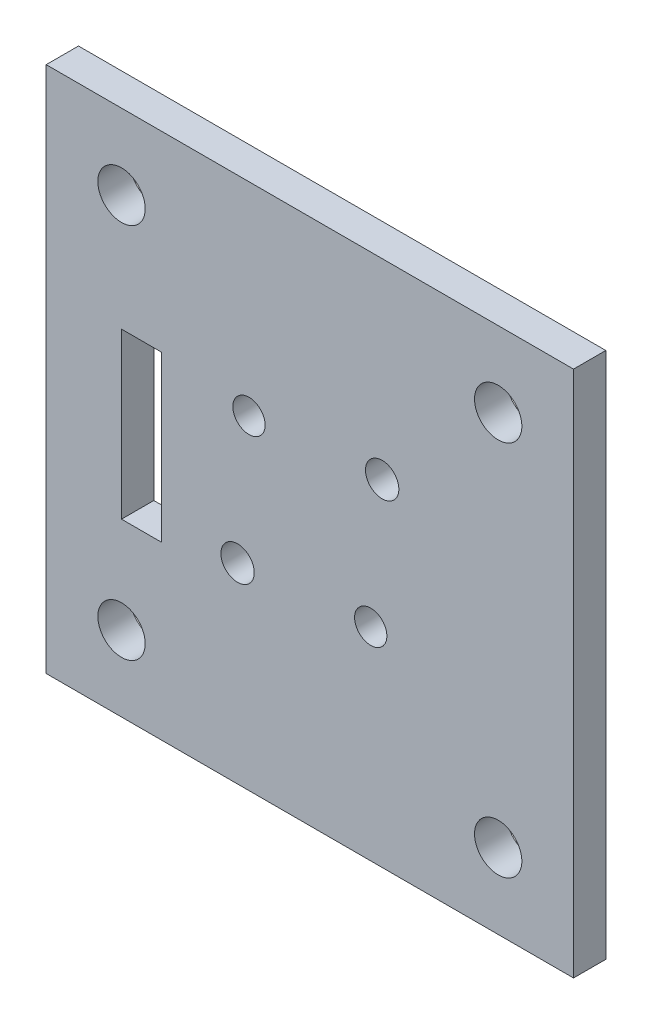
ISO-10303-21;
HEADER;
FILE_DESCRIPTION(('STEP AP214'),'2;1');
FILE_NAME('part.step','',(''),(''),'','','');
FILE_SCHEMA(('AUTOMOTIVE_DESIGN { 1 0 10303 214 1 1 1 1 }'));
ENDSEC;
DATA;
#1=APPLICATION_CONTEXT('core data for automotive mechanical design processes');
#2=APPLICATION_PROTOCOL_DEFINITION('international standard','automotive_design',2000,#1);
#3=PRODUCT_CONTEXT('',#1,'mechanical');
#4=PRODUCT('Part','Part','',(#3));
#5=PRODUCT_RELATED_PRODUCT_CATEGORY('part','',(#4));
#6=PRODUCT_DEFINITION_FORMATION('','',#4);
#7=PRODUCT_DEFINITION_CONTEXT('part definition',#1,'design');
#8=PRODUCT_DEFINITION('design','',#6,#7);
#9=PRODUCT_DEFINITION_SHAPE('','',#8);
#10=(LENGTH_UNIT() NAMED_UNIT(*) SI_UNIT(.MILLI.,.METRE.));
#11=(NAMED_UNIT(*) PLANE_ANGLE_UNIT() SI_UNIT($,.RADIAN.));
#12=(NAMED_UNIT(*) SI_UNIT($,.STERADIAN.) SOLID_ANGLE_UNIT());
#13=UNCERTAINTY_MEASURE_WITH_UNIT(LENGTH_MEASURE(1.E-05),#10,'distance_accuracy_value','');
#14=(GEOMETRIC_REPRESENTATION_CONTEXT(3) GLOBAL_UNCERTAINTY_ASSIGNED_CONTEXT((#13)) GLOBAL_UNIT_ASSIGNED_CONTEXT((#10,
#11,#12)) REPRESENTATION_CONTEXT('',''));
#15=CARTESIAN_POINT('',(0.,0.,0.));
#16=DIRECTION('',(0.,0.,1.));
#17=DIRECTION('',(1.,0.,0.));
#18=AXIS2_PLACEMENT_3D('',#15,#16,#17);
#19=CARTESIAN_POINT('',(0.,-24.5,3.));
#20=DIRECTION('',(0.,1.,0.));
#21=DIRECTION('',(0.,0.,1.));
#22=AXIS2_PLACEMENT_3D('',#19,#20,#21);
#23=PLANE('',#22);
#24=DIRECTION('',(1.,0.,0.));
#25=VECTOR('',#24,1.);
#26=CARTESIAN_POINT('',(0.,-24.5,0.));
#27=LINE('',#26,#25);
#28=CARTESIAN_POINT('',(-24.5,-24.5,0.));
#29=VERTEX_POINT('',#28);
#30=CARTESIAN_POINT('',(24.5,-24.5,0.));
#31=VERTEX_POINT('',#30);
#32=EDGE_CURVE('E194',#29,#31,#27,.T.);
#33=ORIENTED_EDGE('',*,*,#32,.T.);
#34=DIRECTION('',(0.,0.,-1.));
#35=VECTOR('',#34,1.);
#36=CARTESIAN_POINT('',(24.5,-24.5,3.));
#37=LINE('',#36,#35);
#38=CARTESIAN_POINT('',(24.5,-24.5,3.));
#39=VERTEX_POINT('',#38);
#40=EDGE_CURVE('E11',#39,#31,#37,.T.);
#41=ORIENTED_EDGE('',*,*,#40,.F.);
#42=DIRECTION('',(1.,0.,0.));
#43=VECTOR('',#42,1.);
#44=CARTESIAN_POINT('',(0.,-24.5,3.));
#45=LINE('',#44,#43);
#46=CARTESIAN_POINT('',(-24.5,-24.5,3.));
#47=VERTEX_POINT('',#46);
#48=EDGE_CURVE('E171',#47,#39,#45,.T.);
#49=ORIENTED_EDGE('',*,*,#48,.F.);
#50=DIRECTION('',(0.,0.,-1.));
#51=VECTOR('',#50,1.);
#52=CARTESIAN_POINT('',(-24.5,-24.5,3.));
#53=LINE('',#52,#51);
#54=EDGE_CURVE('E182',#47,#29,#53,.T.);
#55=ORIENTED_EDGE('',*,*,#54,.T.);
#56=EDGE_LOOP('',(#33,#41,#49,#55));
#57=FACE_BOUND('',#56,.T.);
#58=ADVANCED_FACE('F37',(#57),#23,.F.);
#59=CARTESIAN_POINT('',(24.5,0.,3.));
#60=DIRECTION('',(-1.,0.,0.));
#61=DIRECTION('',(0.,0.,1.));
#62=AXIS2_PLACEMENT_3D('',#59,#60,#61);
#63=PLANE('',#62);
#64=DIRECTION('',(0.,1.,0.));
#65=VECTOR('',#64,1.);
#66=CARTESIAN_POINT('',(24.5,0.,0.));
#67=LINE('',#66,#65);
#68=CARTESIAN_POINT('',(24.5,24.5,0.));
#69=VERTEX_POINT('',#68);
#70=EDGE_CURVE('E197',#31,#69,#67,.T.);
#71=ORIENTED_EDGE('',*,*,#70,.T.);
#72=DIRECTION('',(0.,0.,-1.));
#73=VECTOR('',#72,1.);
#74=CARTESIAN_POINT('',(24.5,24.5,3.));
#75=LINE('',#74,#73);
#76=CARTESIAN_POINT('',(24.5,24.5,3.));
#77=VERTEX_POINT('',#76);
#78=EDGE_CURVE('E45',#77,#69,#75,.T.);
#79=ORIENTED_EDGE('',*,*,#78,.F.);
#80=DIRECTION('',(0.,1.,0.));
#81=VECTOR('',#80,1.);
#82=CARTESIAN_POINT('',(24.5,0.,3.));
#83=LINE('',#82,#81);
#84=EDGE_CURVE('E174',#39,#77,#83,.T.);
#85=ORIENTED_EDGE('',*,*,#84,.F.);
#86=ORIENTED_EDGE('',*,*,#40,.T.);
#87=EDGE_LOOP('',(#71,#79,#85,#86));
#88=FACE_BOUND('',#87,.T.);
#89=ADVANCED_FACE('F213',(#88),#63,.F.);
#90=CARTESIAN_POINT('',(0.,24.5,3.));
#91=DIRECTION('',(0.,1.,0.));
#92=DIRECTION('',(0.,0.,1.));
#93=AXIS2_PLACEMENT_3D('',#90,#91,#92);
#94=PLANE('',#93);
#95=DIRECTION('',(1.,0.,0.));
#96=VECTOR('',#95,1.);
#97=CARTESIAN_POINT('',(0.,24.5,0.));
#98=LINE('',#97,#96);
#99=CARTESIAN_POINT('',(-24.5,24.5,0.));
#100=VERTEX_POINT('',#99);
#101=EDGE_CURVE('E200',#100,#69,#98,.T.);
#102=ORIENTED_EDGE('',*,*,#101,.F.);
#103=DIRECTION('',(0.,0.,-1.));
#104=VECTOR('',#103,1.);
#105=CARTESIAN_POINT('',(-24.5,24.5,3.));
#106=LINE('',#105,#104);
#107=CARTESIAN_POINT('',(-24.5,24.5,3.));
#108=VERTEX_POINT('',#107);
#109=EDGE_CURVE('E206',#108,#100,#106,.T.);
#110=ORIENTED_EDGE('',*,*,#109,.F.);
#111=DIRECTION('',(1.,0.,0.));
#112=VECTOR('',#111,1.);
#113=CARTESIAN_POINT('',(0.,24.5,3.));
#114=LINE('',#113,#112);
#115=EDGE_CURVE('E176',#108,#77,#114,.T.);
#116=ORIENTED_EDGE('',*,*,#115,.T.);
#117=ORIENTED_EDGE('',*,*,#78,.T.);
#118=EDGE_LOOP('',(#102,#110,#116,#117));
#119=FACE_BOUND('',#118,.T.);
#120=ADVANCED_FACE('F210',(#119),#94,.T.);
#121=CARTESIAN_POINT('',(-17.5,17.5,3.));
#122=DIRECTION('',(0.,0.,-1.));
#123=DIRECTION('',(-1.,0.,0.));
#124=AXIS2_PLACEMENT_3D('',#121,#122,#123);
#125=CYLINDRICAL_SURFACE('',#124,2.2);
#126=CARTESIAN_POINT('',(-17.5,17.5,3.));
#127=DIRECTION('',(0.,0.,1.));
#128=DIRECTION('',(1.,0.,0.));
#129=AXIS2_PLACEMENT_3D('',#126,#127,#128);
#130=CIRCLE('',#129,2.2);
#131=CARTESIAN_POINT('',(-15.3,17.5,3.));
#132=VERTEX_POINT('',#131);
#133=EDGE_CURVE('E168',#132,#132,#130,.T.);
#134=ORIENTED_EDGE('',*,*,#133,.T.);
#135=EDGE_LOOP('',(#134));
#136=FACE_BOUND('',#135,.T.);
#137=CARTESIAN_POINT('',(-17.5,17.5,0.));
#138=DIRECTION('',(0.,0.,1.));
#139=DIRECTION('',(1.,0.,0.));
#140=AXIS2_PLACEMENT_3D('',#137,#138,#139);
#141=CIRCLE('',#140,2.2);
#142=CARTESIAN_POINT('',(-15.3,17.5,0.));
#143=VERTEX_POINT('',#142);
#144=EDGE_CURVE('E191',#143,#143,#141,.T.);
#145=ORIENTED_EDGE('',*,*,#144,.F.);
#146=EDGE_LOOP('',(#145));
#147=FACE_BOUND('',#146,.T.);
#148=ADVANCED_FACE('F233',(#136,#147),#125,.F.);
#149=CARTESIAN_POINT('',(17.5,-17.5,3.));
#150=DIRECTION('',(0.,0.,-1.));
#151=DIRECTION('',(-1.,0.,0.));
#152=AXIS2_PLACEMENT_3D('',#149,#150,#151);
#153=CYLINDRICAL_SURFACE('',#152,2.2);
#154=CARTESIAN_POINT('',(17.5,-17.5,3.));
#155=DIRECTION('',(0.,0.,1.));
#156=DIRECTION('',(1.,0.,0.));
#157=AXIS2_PLACEMENT_3D('',#154,#155,#156);
#158=CIRCLE('',#157,2.2);
#159=CARTESIAN_POINT('',(19.7,-17.5,3.));
#160=VERTEX_POINT('',#159);
#161=EDGE_CURVE('E165',#160,#160,#158,.T.);
#162=ORIENTED_EDGE('',*,*,#161,.T.);
#163=EDGE_LOOP('',(#162));
#164=FACE_BOUND('',#163,.T.);
#165=CARTESIAN_POINT('',(17.5,-17.5,0.));
#166=DIRECTION('',(0.,0.,1.));
#167=DIRECTION('',(1.,0.,0.));
#168=AXIS2_PLACEMENT_3D('',#165,#166,#167);
#169=CIRCLE('',#168,2.2);
#170=CARTESIAN_POINT('',(19.7,-17.5,0.));
#171=VERTEX_POINT('',#170);
#172=EDGE_CURVE('E188',#171,#171,#169,.T.);
#173=ORIENTED_EDGE('',*,*,#172,.F.);
#174=EDGE_LOOP('',(#173));
#175=FACE_BOUND('',#174,.T.);
#176=ADVANCED_FACE('F236',(#164,#175),#153,.F.);
#177=CARTESIAN_POINT('',(17.5,17.5,3.));
#178=DIRECTION('',(0.,0.,-1.));
#179=DIRECTION('',(-1.,0.,0.));
#180=AXIS2_PLACEMENT_3D('',#177,#178,#179);
#181=CYLINDRICAL_SURFACE('',#180,2.2);
#182=CARTESIAN_POINT('',(17.5,17.5,3.));
#183=DIRECTION('',(0.,0.,1.));
#184=DIRECTION('',(1.,0.,0.));
#185=AXIS2_PLACEMENT_3D('',#182,#183,#184);
#186=CIRCLE('',#185,2.2);
#187=CARTESIAN_POINT('',(19.7,17.5,3.));
#188=VERTEX_POINT('',#187);
#189=EDGE_CURVE('E161',#188,#188,#186,.T.);
#190=ORIENTED_EDGE('',*,*,#189,.T.);
#191=EDGE_LOOP('',(#190));
#192=FACE_BOUND('',#191,.T.);
#193=CARTESIAN_POINT('',(17.5,17.5,0.));
#194=DIRECTION('',(0.,0.,1.));
#195=DIRECTION('',(1.,0.,0.));
#196=AXIS2_PLACEMENT_3D('',#193,#194,#195);
#197=CIRCLE('',#196,2.2);
#198=CARTESIAN_POINT('',(19.7,17.5,0.));
#199=VERTEX_POINT('',#198);
#200=EDGE_CURVE('E185',#199,#199,#197,.T.);
#201=ORIENTED_EDGE('',*,*,#200,.F.);
#202=EDGE_LOOP('',(#201));
#203=FACE_BOUND('',#202,.T.);
#204=ADVANCED_FACE('F239',(#192,#203),#181,.F.);
#205=CARTESIAN_POINT('',(-17.5,-17.5,3.));
#206=DIRECTION('',(0.,0.,-1.));
#207=DIRECTION('',(-1.,0.,0.));
#208=AXIS2_PLACEMENT_3D('',#205,#206,#207);
#209=CYLINDRICAL_SURFACE('',#208,2.2);
#210=CARTESIAN_POINT('',(-17.5,-17.5,3.));
#211=DIRECTION('',(0.,0.,1.));
#212=DIRECTION('',(1.,0.,0.));
#213=AXIS2_PLACEMENT_3D('',#210,#211,#212);
#214=CIRCLE('',#213,2.2);
#215=CARTESIAN_POINT('',(-15.3,-17.5,3.));
#216=VERTEX_POINT('',#215);
#217=EDGE_CURVE('E158',#216,#216,#214,.T.);
#218=ORIENTED_EDGE('',*,*,#217,.T.);
#219=EDGE_LOOP('',(#218));
#220=FACE_BOUND('',#219,.T.);
#221=CARTESIAN_POINT('',(-17.5,-17.5,0.));
#222=DIRECTION('',(0.,0.,1.));
#223=DIRECTION('',(1.,0.,0.));
#224=AXIS2_PLACEMENT_3D('',#221,#222,#223);
#225=CIRCLE('',#224,2.2);
#226=CARTESIAN_POINT('',(-15.3,-17.5,0.));
#227=VERTEX_POINT('',#226);
#228=EDGE_CURVE('E155',#227,#227,#225,.T.);
#229=ORIENTED_EDGE('',*,*,#228,.F.);
#230=EDGE_LOOP('',(#229));
#231=FACE_BOUND('',#230,.T.);
#232=ADVANCED_FACE('F39',(#220,#231),#209,.F.);
#233=CARTESIAN_POINT('',(-24.5,0.,3.));
#234=DIRECTION('',(-1.,0.,0.));
#235=DIRECTION('',(0.,0.,1.));
#236=AXIS2_PLACEMENT_3D('',#233,#234,#235);
#237=PLANE('',#236);
#238=DIRECTION('',(0.,1.,0.));
#239=VECTOR('',#238,1.);
#240=CARTESIAN_POINT('',(-24.5,0.,0.));
#241=LINE('',#240,#239);
#242=EDGE_CURVE('E162',#29,#100,#241,.T.);
#243=ORIENTED_EDGE('',*,*,#242,.F.);
#244=ORIENTED_EDGE('',*,*,#54,.F.);
#245=DIRECTION('',(0.,1.,0.));
#246=VECTOR('',#245,1.);
#247=CARTESIAN_POINT('',(-24.5,0.,3.));
#248=LINE('',#247,#246);
#249=EDGE_CURVE('E179',#47,#108,#248,.T.);
#250=ORIENTED_EDGE('',*,*,#249,.T.);
#251=ORIENTED_EDGE('',*,*,#109,.T.);
#252=EDGE_LOOP('',(#243,#244,#250,#251));
#253=FACE_BOUND('',#252,.T.);
#254=ADVANCED_FACE('F219',(#253),#237,.T.);
#255=CARTESIAN_POINT('',(0.,0.,3.));
#256=DIRECTION('',(0.,0.,1.));
#257=DIRECTION('',(1.,0.,0.));
#258=AXIS2_PLACEMENT_3D('',#255,#256,#257);
#259=PLANE('',#258);
#260=CARTESIAN_POINT('',(-5.65685424949238,5.65685424949239,3.));
#261=DIRECTION('',(0.,0.,-1.));
#262=DIRECTION('',(-1.,0.,0.));
#263=AXIS2_PLACEMENT_3D('',#260,#261,#262);
#264=CIRCLE('',#263,1.5);
#265=CARTESIAN_POINT('',(-7.15685424949238,5.65685424949239,3.));
#266=VERTEX_POINT('',#265);
#267=EDGE_CURVE('E143',#266,#266,#264,.T.);
#268=ORIENTED_EDGE('',*,*,#267,.T.);
#269=EDGE_LOOP('',(#268));
#270=FACE_BOUND('',#269,.T.);
#271=CARTESIAN_POINT('',(-6.7175144212722,-6.71751442127219,3.));
#272=DIRECTION('',(0.,0.,-1.));
#273=DIRECTION('',(-1.,0.,0.));
#274=AXIS2_PLACEMENT_3D('',#271,#272,#273);
#275=CIRCLE('',#274,1.55);
#276=CARTESIAN_POINT('',(-8.2675144212722,-6.71751442127219,3.));
#277=VERTEX_POINT('',#276);
#278=EDGE_CURVE('E149',#277,#277,#275,.T.);
#279=ORIENTED_EDGE('',*,*,#278,.T.);
#280=EDGE_LOOP('',(#279));
#281=FACE_BOUND('',#280,.T.);
#282=CARTESIAN_POINT('',(5.65685424949237,-5.65685424949236,3.));
#283=DIRECTION('',(0.,0.,-1.));
#284=DIRECTION('',(-1.,0.,0.));
#285=AXIS2_PLACEMENT_3D('',#282,#283,#284);
#286=CIRCLE('',#285,1.5);
#287=CARTESIAN_POINT('',(4.15685424949237,-5.65685424949236,3.));
#288=VERTEX_POINT('',#287);
#289=EDGE_CURVE('E123',#288,#288,#286,.T.);
#290=ORIENTED_EDGE('',*,*,#289,.T.);
#291=EDGE_LOOP('',(#290));
#292=FACE_BOUND('',#291,.T.);
#293=DIRECTION('',(0.,-1.,0.));
#294=VECTOR('',#293,1.);
#295=CARTESIAN_POINT('',(-13.8005288029536,6.71751442127221,3.));
#296=LINE('',#295,#294);
#297=CARTESIAN_POINT('',(-13.8005288029536,6.71751442127221,3.));
#298=VERTEX_POINT('',#297);
#299=CARTESIAN_POINT('',(-13.8005288029536,-8.57667756851141,3.));
#300=VERTEX_POINT('',#299);
#301=EDGE_CURVE('E104',#298,#300,#296,.T.);
#302=ORIENTED_EDGE('',*,*,#301,.T.);
#303=DIRECTION('',(-1.,0.,0.));
#304=VECTOR('',#303,1.);
#305=CARTESIAN_POINT('',(-13.8005288029536,-8.57667756851141,3.));
#306=LINE('',#305,#304);
#307=CARTESIAN_POINT('',(-17.5,-8.57667756851141,3.));
#308=VERTEX_POINT('',#307);
#309=EDGE_CURVE('E135',#300,#308,#306,.T.);
#310=ORIENTED_EDGE('',*,*,#309,.T.);
#311=DIRECTION('',(0.,1.,0.));
#312=VECTOR('',#311,1.);
#313=CARTESIAN_POINT('',(-17.5,6.71751442127221,3.));
#314=LINE('',#313,#312);
#315=CARTESIAN_POINT('',(-17.5,6.71751442127221,3.));
#316=VERTEX_POINT('',#315);
#317=EDGE_CURVE('E52',#308,#316,#314,.T.);
#318=ORIENTED_EDGE('',*,*,#317,.T.);
#319=DIRECTION('',(1.,0.,0.));
#320=VECTOR('',#319,1.);
#321=CARTESIAN_POINT('',(-13.8005288029536,6.71751442127221,3.));
#322=LINE('',#321,#320);
#323=EDGE_CURVE('E131',#316,#298,#322,.T.);
#324=ORIENTED_EDGE('',*,*,#323,.T.);
#325=EDGE_LOOP('',(#302,#310,#318,#324));
#326=FACE_BOUND('',#325,.T.);
#327=CARTESIAN_POINT('',(6.7175144212722,6.71751442127221,3.));
#328=DIRECTION('',(0.,0.,-1.));
#329=DIRECTION('',(-1.,0.,0.));
#330=AXIS2_PLACEMENT_3D('',#327,#328,#329);
#331=CIRCLE('',#330,1.55);
#332=CARTESIAN_POINT('',(5.1675144212722,6.71751442127221,3.));
#333=VERTEX_POINT('',#332);
#334=EDGE_CURVE('E152',#333,#333,#331,.T.);
#335=ORIENTED_EDGE('',*,*,#334,.T.);
#336=EDGE_LOOP('',(#335));
#337=FACE_BOUND('',#336,.T.);
#338=ORIENTED_EDGE('',*,*,#217,.F.);
#339=EDGE_LOOP('',(#338));
#340=FACE_BOUND('',#339,.T.);
#341=ORIENTED_EDGE('',*,*,#189,.F.);
#342=EDGE_LOOP('',(#341));
#343=FACE_BOUND('',#342,.T.);
#344=ORIENTED_EDGE('',*,*,#161,.F.);
#345=EDGE_LOOP('',(#344));
#346=FACE_BOUND('',#345,.T.);
#347=ORIENTED_EDGE('',*,*,#133,.F.);
#348=EDGE_LOOP('',(#347));
#349=FACE_BOUND('',#348,.T.);
#350=ORIENTED_EDGE('',*,*,#48,.T.);
#351=ORIENTED_EDGE('',*,*,#84,.T.);
#352=ORIENTED_EDGE('',*,*,#115,.F.);
#353=ORIENTED_EDGE('',*,*,#249,.F.);
#354=EDGE_LOOP('',(#350,#351,#352,#353));
#355=FACE_BOUND('',#354,.T.);
#356=ADVANCED_FACE('F223',(#270,#281,#292,#326,#337,#340,#343,#346,#349,#355),#259,.T.);
#357=CARTESIAN_POINT('',(0.,0.,0.));
#358=DIRECTION('',(0.,0.,1.));
#359=DIRECTION('',(1.,0.,0.));
#360=AXIS2_PLACEMENT_3D('',#357,#358,#359);
#361=PLANE('',#360);
#362=CARTESIAN_POINT('',(-5.65685424949238,5.65685424949239,0.));
#363=DIRECTION('',(0.,0.,-1.));
#364=DIRECTION('',(-1.,0.,0.));
#365=AXIS2_PLACEMENT_3D('',#362,#363,#364);
#366=CIRCLE('',#365,1.5);
#367=CARTESIAN_POINT('',(-7.15685424949238,5.65685424949239,0.));
#368=VERTEX_POINT('',#367);
#369=EDGE_CURVE('E139',#368,#368,#366,.T.);
#370=ORIENTED_EDGE('',*,*,#369,.F.);
#371=EDGE_LOOP('',(#370));
#372=FACE_BOUND('',#371,.T.);
#373=CARTESIAN_POINT('',(-6.7175144212722,-6.71751442127219,0.));
#374=DIRECTION('',(0.,0.,-1.));
#375=DIRECTION('',(-1.,0.,0.));
#376=AXIS2_PLACEMENT_3D('',#373,#374,#375);
#377=CIRCLE('',#376,1.55);
#378=CARTESIAN_POINT('',(-8.2675144212722,-6.71751442127219,0.));
#379=VERTEX_POINT('',#378);
#380=EDGE_CURVE('E146',#379,#379,#377,.T.);
#381=ORIENTED_EDGE('',*,*,#380,.F.);
#382=EDGE_LOOP('',(#381));
#383=FACE_BOUND('',#382,.T.);
#384=CARTESIAN_POINT('',(5.65685424949237,-5.65685424949236,0.));
#385=DIRECTION('',(0.,0.,-1.));
#386=DIRECTION('',(-1.,0.,0.));
#387=AXIS2_PLACEMENT_3D('',#384,#385,#386);
#388=CIRCLE('',#387,1.5);
#389=CARTESIAN_POINT('',(4.15685424949237,-5.65685424949236,0.));
#390=VERTEX_POINT('',#389);
#391=EDGE_CURVE('E126',#390,#390,#388,.T.);
#392=ORIENTED_EDGE('',*,*,#391,.F.);
#393=EDGE_LOOP('',(#392));
#394=FACE_BOUND('',#393,.T.);
#395=DIRECTION('',(-1.,0.,0.));
#396=VECTOR('',#395,1.);
#397=CARTESIAN_POINT('',(-13.8005288029536,-8.57667756851141,0.));
#398=LINE('',#397,#396);
#399=CARTESIAN_POINT('',(-13.8005288029536,-8.57667756851141,0.));
#400=VERTEX_POINT('',#399);
#401=CARTESIAN_POINT('',(-17.5,-8.57667756851141,0.));
#402=VERTEX_POINT('',#401);
#403=EDGE_CURVE('E122',#400,#402,#398,.T.);
#404=ORIENTED_EDGE('',*,*,#403,.F.);
#405=DIRECTION('',(0.,-1.,0.));
#406=VECTOR('',#405,1.);
#407=CARTESIAN_POINT('',(-13.8005288029536,6.71751442127221,0.));
#408=LINE('',#407,#406);
#409=CARTESIAN_POINT('',(-13.8005288029536,6.71751442127221,0.));
#410=VERTEX_POINT('',#409);
#411=EDGE_CURVE('E60',#410,#400,#408,.T.);
#412=ORIENTED_EDGE('',*,*,#411,.F.);
#413=DIRECTION('',(1.,0.,0.));
#414=VECTOR('',#413,1.);
#415=CARTESIAN_POINT('',(-13.8005288029536,6.71751442127221,0.));
#416=LINE('',#415,#414);
#417=CARTESIAN_POINT('',(-17.5,6.71751442127221,0.));
#418=VERTEX_POINT('',#417);
#419=EDGE_CURVE('E111',#418,#410,#416,.T.);
#420=ORIENTED_EDGE('',*,*,#419,.F.);
#421=DIRECTION('',(0.,1.,0.));
#422=VECTOR('',#421,1.);
#423=CARTESIAN_POINT('',(-17.5,6.71751442127221,0.));
#424=LINE('',#423,#422);
#425=EDGE_CURVE('E116',#402,#418,#424,.T.);
#426=ORIENTED_EDGE('',*,*,#425,.F.);
#427=EDGE_LOOP('',(#404,#412,#420,#426));
#428=FACE_BOUND('',#427,.T.);
#429=CARTESIAN_POINT('',(6.7175144212722,6.71751442127221,0.));
#430=DIRECTION('',(0.,0.,-1.));
#431=DIRECTION('',(-1.,0.,0.));
#432=AXIS2_PLACEMENT_3D('',#429,#430,#431);
#433=CIRCLE('',#432,1.55);
#434=CARTESIAN_POINT('',(5.1675144212722,6.71751442127221,0.));
#435=VERTEX_POINT('',#434);
#436=EDGE_CURVE('E142',#435,#435,#433,.T.);
#437=ORIENTED_EDGE('',*,*,#436,.F.);
#438=EDGE_LOOP('',(#437));
#439=FACE_BOUND('',#438,.T.);
#440=ORIENTED_EDGE('',*,*,#228,.T.);
#441=EDGE_LOOP('',(#440));
#442=FACE_BOUND('',#441,.T.);
#443=ORIENTED_EDGE('',*,*,#200,.T.);
#444=EDGE_LOOP('',(#443));
#445=FACE_BOUND('',#444,.T.);
#446=ORIENTED_EDGE('',*,*,#172,.T.);
#447=EDGE_LOOP('',(#446));
#448=FACE_BOUND('',#447,.T.);
#449=ORIENTED_EDGE('',*,*,#144,.T.);
#450=EDGE_LOOP('',(#449));
#451=FACE_BOUND('',#450,.T.);
#452=ORIENTED_EDGE('',*,*,#32,.F.);
#453=ORIENTED_EDGE('',*,*,#242,.T.);
#454=ORIENTED_EDGE('',*,*,#101,.T.);
#455=ORIENTED_EDGE('',*,*,#70,.F.);
#456=EDGE_LOOP('',(#452,#453,#454,#455));
#457=FACE_BOUND('',#456,.T.);
#458=ADVANCED_FACE('F119',(#372,#383,#394,#428,#439,#442,#445,#448,#451,#457),#361,.F.);
#459=CARTESIAN_POINT('',(6.7175144212722,6.71751442127221,3.));
#460=DIRECTION('',(0.,0.,-1.));
#461=DIRECTION('',(-1.,0.,0.));
#462=AXIS2_PLACEMENT_3D('',#459,#460,#461);
#463=CYLINDRICAL_SURFACE('',#462,1.55);
#464=ORIENTED_EDGE('',*,*,#334,.F.);
#465=EDGE_LOOP('',(#464));
#466=FACE_BOUND('',#465,.T.);
#467=ORIENTED_EDGE('',*,*,#436,.T.);
#468=EDGE_LOOP('',(#467));
#469=FACE_BOUND('',#468,.T.);
#470=ADVANCED_FACE('F253',(#466,#469),#463,.F.);
#471=CARTESIAN_POINT('',(-13.8005288029536,6.71751442127221,3.));
#472=DIRECTION('',(1.,0.,0.));
#473=DIRECTION('',(0.,0.,-1.));
#474=AXIS2_PLACEMENT_3D('',#471,#472,#473);
#475=PLANE('',#474);
#476=ORIENTED_EDGE('',*,*,#411,.T.);
#477=DIRECTION('',(0.,0.,-1.));
#478=VECTOR('',#477,1.);
#479=CARTESIAN_POINT('',(-13.8005288029536,-8.57667756851141,3.));
#480=LINE('',#479,#478);
#481=EDGE_CURVE('E133',#300,#400,#480,.T.);
#482=ORIENTED_EDGE('',*,*,#481,.F.);
#483=ORIENTED_EDGE('',*,*,#301,.F.);
#484=DIRECTION('',(0.,0.,-1.));
#485=VECTOR('',#484,1.);
#486=CARTESIAN_POINT('',(-13.8005288029536,6.71751442127221,3.));
#487=LINE('',#486,#485);
#488=EDGE_CURVE('E100',#298,#410,#487,.T.);
#489=ORIENTED_EDGE('',*,*,#488,.T.);
#490=EDGE_LOOP('',(#476,#482,#483,#489));
#491=FACE_BOUND('',#490,.T.);
#492=ADVANCED_FACE('F102',(#491),#475,.F.);
#493=CARTESIAN_POINT('',(-13.8005288029536,6.71751442127221,3.));
#494=DIRECTION('',(0.,1.,0.));
#495=DIRECTION('',(0.,0.,1.));
#496=AXIS2_PLACEMENT_3D('',#493,#494,#495);
#497=PLANE('',#496);
#498=ORIENTED_EDGE('',*,*,#419,.T.);
#499=ORIENTED_EDGE('',*,*,#488,.F.);
#500=ORIENTED_EDGE('',*,*,#323,.F.);
#501=DIRECTION('',(0.,0.,-1.));
#502=VECTOR('',#501,1.);
#503=CARTESIAN_POINT('',(-17.5,6.71751442127221,3.));
#504=LINE('',#503,#502);
#505=EDGE_CURVE('E108',#316,#418,#504,.T.);
#506=ORIENTED_EDGE('',*,*,#505,.T.);
#507=EDGE_LOOP('',(#498,#499,#500,#506));
#508=FACE_BOUND('',#507,.T.);
#509=ADVANCED_FACE('F112',(#508),#497,.F.);
#510=CARTESIAN_POINT('',(-17.5,6.71751442127221,3.));
#511=DIRECTION('',(-1.,0.,0.));
#512=DIRECTION('',(0.,0.,1.));
#513=AXIS2_PLACEMENT_3D('',#510,#511,#512);
#514=PLANE('',#513);
#515=ORIENTED_EDGE('',*,*,#425,.T.);
#516=ORIENTED_EDGE('',*,*,#505,.F.);
#517=ORIENTED_EDGE('',*,*,#317,.F.);
#518=DIRECTION('',(0.,0.,-1.));
#519=VECTOR('',#518,1.);
#520=CARTESIAN_POINT('',(-17.5,-8.57667756851141,3.));
#521=LINE('',#520,#519);
#522=EDGE_CURVE('E457',#308,#402,#521,.T.);
#523=ORIENTED_EDGE('',*,*,#522,.T.);
#524=EDGE_LOOP('',(#515,#516,#517,#523));
#525=FACE_BOUND('',#524,.T.);
#526=ADVANCED_FACE('F343',(#525),#514,.F.);
#527=CARTESIAN_POINT('',(-13.8005288029536,-8.57667756851141,3.));
#528=DIRECTION('',(0.,-1.,0.));
#529=DIRECTION('',(0.,0.,-1.));
#530=AXIS2_PLACEMENT_3D('',#527,#528,#529);
#531=PLANE('',#530);
#532=ORIENTED_EDGE('',*,*,#403,.T.);
#533=ORIENTED_EDGE('',*,*,#522,.F.);
#534=ORIENTED_EDGE('',*,*,#309,.F.);
#535=ORIENTED_EDGE('',*,*,#481,.T.);
#536=EDGE_LOOP('',(#532,#533,#534,#535));
#537=FACE_BOUND('',#536,.T.);
#538=ADVANCED_FACE('F353',(#537),#531,.F.);
#539=CARTESIAN_POINT('',(5.65685424949237,-5.65685424949236,3.));
#540=DIRECTION('',(0.,0.,-1.));
#541=DIRECTION('',(-1.,0.,0.));
#542=AXIS2_PLACEMENT_3D('',#539,#540,#541);
#543=CYLINDRICAL_SURFACE('',#542,1.5);
#544=ORIENTED_EDGE('',*,*,#289,.F.);
#545=EDGE_LOOP('',(#544));
#546=FACE_BOUND('',#545,.T.);
#547=ORIENTED_EDGE('',*,*,#391,.T.);
#548=EDGE_LOOP('',(#547));
#549=FACE_BOUND('',#548,.T.);
#550=ADVANCED_FACE('F363',(#546,#549),#543,.F.);
#551=CARTESIAN_POINT('',(-6.7175144212722,-6.71751442127219,3.));
#552=DIRECTION('',(0.,0.,-1.));
#553=DIRECTION('',(-1.,0.,0.));
#554=AXIS2_PLACEMENT_3D('',#551,#552,#553);
#555=CYLINDRICAL_SURFACE('',#554,1.55);
#556=ORIENTED_EDGE('',*,*,#278,.F.);
#557=EDGE_LOOP('',(#556));
#558=FACE_BOUND('',#557,.T.);
#559=ORIENTED_EDGE('',*,*,#380,.T.);
#560=EDGE_LOOP('',(#559));
#561=FACE_BOUND('',#560,.T.);
#562=ADVANCED_FACE('F374',(#558,#561),#555,.F.);
#563=CARTESIAN_POINT('',(-5.65685424949238,5.65685424949239,3.));
#564=DIRECTION('',(0.,0.,-1.));
#565=DIRECTION('',(-1.,0.,0.));
#566=AXIS2_PLACEMENT_3D('',#563,#564,#565);
#567=CYLINDRICAL_SURFACE('',#566,1.5);
#568=ORIENTED_EDGE('',*,*,#267,.F.);
#569=EDGE_LOOP('',(#568));
#570=FACE_BOUND('',#569,.T.);
#571=ORIENTED_EDGE('',*,*,#369,.T.);
#572=EDGE_LOOP('',(#571));
#573=FACE_BOUND('',#572,.T.);
#574=ADVANCED_FACE('F385',(#570,#573),#567,.F.);
#575=CLOSED_SHELL('',(#58,#89,#120,#148,#176,#204,#232,#254,#356,#458,#470,#492,#509,#526,#538,
#550,#562,#574));
#576=MANIFOLD_SOLID_BREP('B2',#575);
#577=ADVANCED_BREP_SHAPE_REPRESENTATION('',(#18,#576),#14);
#578=SHAPE_DEFINITION_REPRESENTATION(#9,#577);
ENDSEC;
END-ISO-10303-21;
